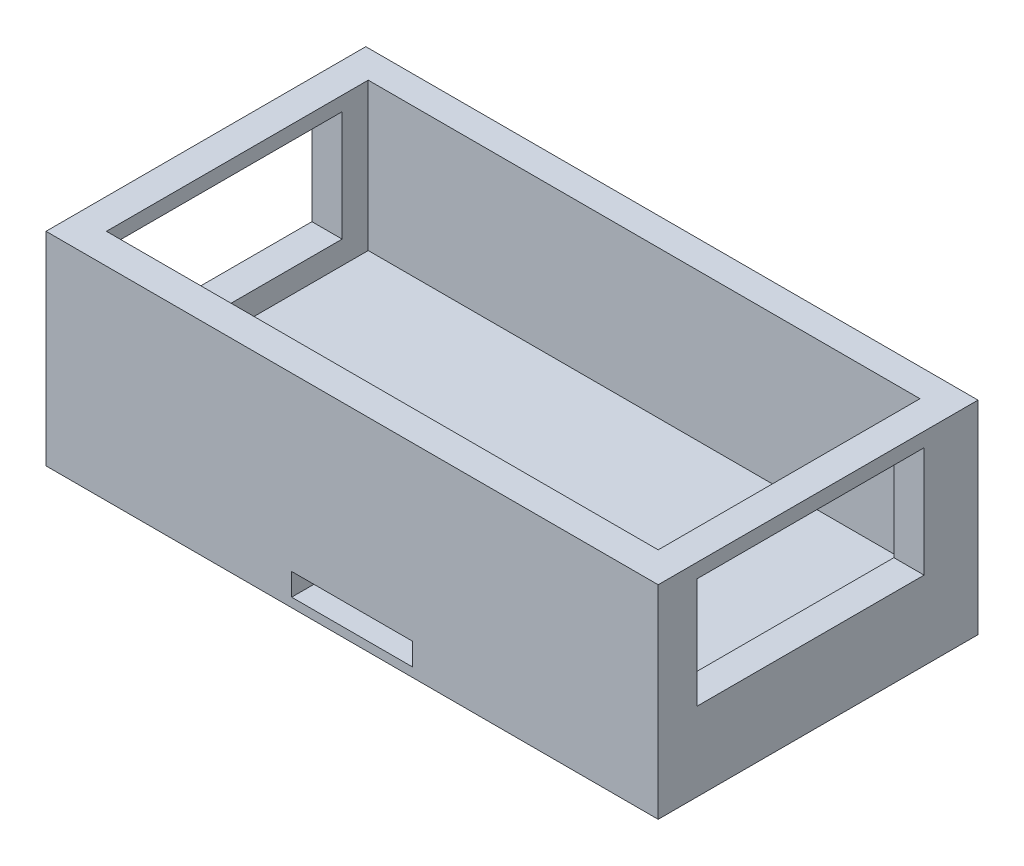
ISO-10303-21;
HEADER;
FILE_DESCRIPTION(('STEP AP214'),'2;1');
FILE_NAME('part.step','',(''),(''),'','','');
FILE_SCHEMA(('AUTOMOTIVE_DESIGN { 1 0 10303 214 1 1 1 1 }'));
ENDSEC;
DATA;
#1=APPLICATION_CONTEXT('core data for automotive mechanical design processes');
#2=APPLICATION_PROTOCOL_DEFINITION('international standard','automotive_design',2000,#1);
#3=PRODUCT_CONTEXT('',#1,'mechanical');
#4=PRODUCT('Part','Part','',(#3));
#5=PRODUCT_RELATED_PRODUCT_CATEGORY('part','',(#4));
#6=PRODUCT_DEFINITION_FORMATION('','',#4);
#7=PRODUCT_DEFINITION_CONTEXT('part definition',#1,'design');
#8=PRODUCT_DEFINITION('design','',#6,#7);
#9=PRODUCT_DEFINITION_SHAPE('','',#8);
#10=(LENGTH_UNIT() NAMED_UNIT(*) SI_UNIT(.MILLI.,.METRE.));
#11=(NAMED_UNIT(*) PLANE_ANGLE_UNIT() SI_UNIT($,.RADIAN.));
#12=(NAMED_UNIT(*) SI_UNIT($,.STERADIAN.) SOLID_ANGLE_UNIT());
#13=UNCERTAINTY_MEASURE_WITH_UNIT(LENGTH_MEASURE(1.E-05),#10,'distance_accuracy_value','');
#14=(GEOMETRIC_REPRESENTATION_CONTEXT(3) GLOBAL_UNCERTAINTY_ASSIGNED_CONTEXT((#13)) GLOBAL_UNIT_ASSIGNED_CONTEXT((#10,
#11,#12)) REPRESENTATION_CONTEXT('',''));
#15=CARTESIAN_POINT('',(0.,0.,0.));
#16=DIRECTION('',(0.,0.,1.));
#17=DIRECTION('',(1.,0.,0.));
#18=AXIS2_PLACEMENT_3D('',#15,#16,#17);
#19=CARTESIAN_POINT('',(0.,42.6974,0.));
#20=DIRECTION('',(1.,0.,0.));
#21=DIRECTION('',(0.,0.,-1.));
#22=AXIS2_PLACEMENT_3D('',#19,#20,#21);
#23=PLANE('',#22);
#24=DIRECTION('',(0.,0.,1.));
#25=VECTOR('',#24,1.);
#26=CARTESIAN_POINT('',(0.,0.,0.));
#27=LINE('',#26,#25);
#28=CARTESIAN_POINT('',(0.,0.,-67.2084));
#29=VERTEX_POINT('',#28);
#30=CARTESIAN_POINT('',(0.,0.,0.));
#31=VERTEX_POINT('',#30);
#32=EDGE_CURVE('E284',#29,#31,#27,.T.);
#33=ORIENTED_EDGE('',*,*,#32,.T.);
#34=DIRECTION('',(0.,-1.,0.));
#35=VECTOR('',#34,1.);
#36=CARTESIAN_POINT('',(0.,42.6974,0.));
#37=LINE('',#36,#35);
#38=CARTESIAN_POINT('',(0.,42.6974,0.));
#39=VERTEX_POINT('',#38);
#40=EDGE_CURVE('E317',#39,#31,#37,.T.);
#41=ORIENTED_EDGE('',*,*,#40,.F.);
#42=DIRECTION('',(0.,0.,1.));
#43=VECTOR('',#42,1.);
#44=CARTESIAN_POINT('',(0.,42.6974,0.));
#45=LINE('',#44,#43);
#46=CARTESIAN_POINT('',(0.,42.6974,-67.2084));
#47=VERTEX_POINT('',#46);
#48=EDGE_CURVE('E291',#47,#39,#45,.T.);
#49=ORIENTED_EDGE('',*,*,#48,.F.);
#50=DIRECTION('',(0.,-1.,0.));
#51=VECTOR('',#50,1.);
#52=CARTESIAN_POINT('',(0.,42.6974,-67.2084));
#53=LINE('',#52,#51);
#54=EDGE_CURVE('E301',#47,#29,#53,.T.);
#55=ORIENTED_EDGE('',*,*,#54,.T.);
#56=EDGE_LOOP('',(#33,#41,#49,#55));
#57=FACE_BOUND('',#56,.T.);
#58=DIRECTION('',(0.,-1.,0.));
#59=VECTOR('',#58,1.);
#60=CARTESIAN_POINT('',(0.,16.51,-8.128));
#61=LINE('',#60,#59);
#62=CARTESIAN_POINT('',(0.,39.6953082570497,-8.128));
#63=VERTEX_POINT('',#62);
#64=CARTESIAN_POINT('',(0.,16.51,-8.128));
#65=VERTEX_POINT('',#64);
#66=EDGE_CURVE('E50',#63,#65,#61,.T.);
#67=ORIENTED_EDGE('',*,*,#66,.T.);
#68=DIRECTION('',(0.,0.,-1.));
#69=VECTOR('',#68,1.);
#70=CARTESIAN_POINT('',(0.,16.51,-8.128));
#71=LINE('',#70,#69);
#72=CARTESIAN_POINT('',(0.,16.51,-55.88));
#73=VERTEX_POINT('',#72);
#74=EDGE_CURVE('E188',#65,#73,#71,.T.);
#75=ORIENTED_EDGE('',*,*,#74,.T.);
#76=DIRECTION('',(0.,1.,0.));
#77=VECTOR('',#76,1.);
#78=CARTESIAN_POINT('',(0.,16.51,-55.88));
#79=LINE('',#78,#77);
#80=CARTESIAN_POINT('',(0.,39.6953082570497,-55.88));
#81=VERTEX_POINT('',#80);
#82=EDGE_CURVE('E191',#73,#81,#79,.T.);
#83=ORIENTED_EDGE('',*,*,#82,.T.);
#84=DIRECTION('',(0.,0.,1.));
#85=VECTOR('',#84,1.);
#86=CARTESIAN_POINT('',(0.,39.6953082570497,-8.128));
#87=LINE('',#86,#85);
#88=EDGE_CURVE('E197',#81,#63,#87,.T.);
#89=ORIENTED_EDGE('',*,*,#88,.T.);
#90=EDGE_LOOP('',(#67,#75,#83,#89));
#91=FACE_BOUND('',#90,.T.);
#92=ADVANCED_FACE('F36',(#57,#91),#23,.F.);
#93=CARTESIAN_POINT('',(6.35,11.684,-6.35));
#94=DIRECTION('',(-1.,0.,0.));
#95=DIRECTION('',(0.,0.,1.));
#96=AXIS2_PLACEMENT_3D('',#93,#94,#95);
#97=PLANE('',#96);
#98=DIRECTION('',(0.,0.,1.));
#99=VECTOR('',#98,1.);
#100=CARTESIAN_POINT('',(6.35,42.6974,-6.35));
#101=LINE('',#100,#99);
#102=CARTESIAN_POINT('',(6.35,42.6974,-61.3664));
#103=VERTEX_POINT('',#102);
#104=CARTESIAN_POINT('',(6.35,42.6974,-6.35));
#105=VERTEX_POINT('',#104);
#106=EDGE_CURVE('E252',#103,#105,#101,.T.);
#107=ORIENTED_EDGE('',*,*,#106,.T.);
#108=DIRECTION('',(0.,1.,0.));
#109=VECTOR('',#108,1.);
#110=CARTESIAN_POINT('',(6.35,11.684,-6.35));
#111=LINE('',#110,#109);
#112=CARTESIAN_POINT('',(6.35,11.684,-6.35));
#113=VERTEX_POINT('',#112);
#114=EDGE_CURVE('E272',#113,#105,#111,.T.);
#115=ORIENTED_EDGE('',*,*,#114,.F.);
#116=DIRECTION('',(0.,0.,1.));
#117=VECTOR('',#116,1.);
#118=CARTESIAN_POINT('',(6.35,11.684,-6.35));
#119=LINE('',#118,#117);
#120=CARTESIAN_POINT('',(6.35,11.684,-61.3664));
#121=VERTEX_POINT('',#120);
#122=EDGE_CURVE('E259',#121,#113,#119,.T.);
#123=ORIENTED_EDGE('',*,*,#122,.F.);
#124=DIRECTION('',(0.,1.,0.));
#125=VECTOR('',#124,1.);
#126=CARTESIAN_POINT('',(6.35,11.684,-61.3664));
#127=LINE('',#126,#125);
#128=EDGE_CURVE('E282',#121,#103,#127,.T.);
#129=ORIENTED_EDGE('',*,*,#128,.T.);
#130=EDGE_LOOP('',(#107,#115,#123,#129));
#131=FACE_BOUND('',#130,.T.);
#132=DIRECTION('',(0.,-1.,0.));
#133=VECTOR('',#132,1.);
#134=CARTESIAN_POINT('',(6.35,16.51,-8.128));
#135=LINE('',#134,#133);
#136=CARTESIAN_POINT('',(6.35,39.6953082570497,-8.128));
#137=VERTEX_POINT('',#136);
#138=CARTESIAN_POINT('',(6.35,16.51,-8.128));
#139=VERTEX_POINT('',#138);
#140=EDGE_CURVE('E180',#137,#139,#135,.T.);
#141=ORIENTED_EDGE('',*,*,#140,.F.);
#142=DIRECTION('',(0.,0.,1.));
#143=VECTOR('',#142,1.);
#144=CARTESIAN_POINT('',(6.35,39.6953082570497,-8.128));
#145=LINE('',#144,#143);
#146=CARTESIAN_POINT('',(6.35,39.6953082570497,-55.88));
#147=VERTEX_POINT('',#146);
#148=EDGE_CURVE('E172',#147,#137,#145,.T.);
#149=ORIENTED_EDGE('',*,*,#148,.F.);
#150=DIRECTION('',(0.,1.,0.));
#151=VECTOR('',#150,1.);
#152=CARTESIAN_POINT('',(6.35,16.51,-55.88));
#153=LINE('',#152,#151);
#154=CARTESIAN_POINT('',(6.35,16.51,-55.88));
#155=VERTEX_POINT('',#154);
#156=EDGE_CURVE('E179',#155,#147,#153,.T.);
#157=ORIENTED_EDGE('',*,*,#156,.F.);
#158=DIRECTION('',(0.,0.,-1.));
#159=VECTOR('',#158,1.);
#160=CARTESIAN_POINT('',(6.35,16.51,-8.128));
#161=LINE('',#160,#159);
#162=EDGE_CURVE('E184',#139,#155,#161,.T.);
#163=ORIENTED_EDGE('',*,*,#162,.F.);
#164=EDGE_LOOP('',(#141,#149,#157,#163));
#165=FACE_BOUND('',#164,.T.);
#166=ADVANCED_FACE('F187',(#131,#165),#97,.F.);
#167=CARTESIAN_POINT('',(0.,42.6974,0.));
#168=DIRECTION('',(0.,0.,-1.));
#169=DIRECTION('',(-1.,0.,0.));
#170=AXIS2_PLACEMENT_3D('',#167,#168,#169);
#171=PLANE('',#170);
#172=DIRECTION('',(1.,0.,0.));
#173=VECTOR('',#172,1.);
#174=CARTESIAN_POINT('',(51.6255,1.91937937556223,0.));
#175=LINE('',#174,#173);
#176=CARTESIAN_POINT('',(51.6255,1.91937937556223,0.));
#177=VERTEX_POINT('',#176);
#178=CARTESIAN_POINT('',(77.0255,1.91937937556223,0.));
#179=VERTEX_POINT('',#178);
#180=EDGE_CURVE('E240',#177,#179,#175,.T.);
#181=ORIENTED_EDGE('',*,*,#180,.F.);
#182=DIRECTION('',(0.,-1.,0.));
#183=VECTOR('',#182,1.);
#184=CARTESIAN_POINT('',(51.6255,1.91937937556223,0.));
#185=LINE('',#184,#183);
#186=CARTESIAN_POINT('',(51.6255,6.604,0.));
#187=VERTEX_POINT('',#186);
#188=EDGE_CURVE('E232',#187,#177,#185,.T.);
#189=ORIENTED_EDGE('',*,*,#188,.F.);
#190=DIRECTION('',(-1.,0.,0.));
#191=VECTOR('',#190,1.);
#192=CARTESIAN_POINT('',(51.6255,6.604,0.));
#193=LINE('',#192,#191);
#194=CARTESIAN_POINT('',(77.0255,6.604,0.));
#195=VERTEX_POINT('',#194);
#196=EDGE_CURVE('E246',#195,#187,#193,.T.);
#197=ORIENTED_EDGE('',*,*,#196,.F.);
#198=DIRECTION('',(0.,1.,0.));
#199=VECTOR('',#198,1.);
#200=CARTESIAN_POINT('',(77.0255,1.91937937556223,0.));
#201=LINE('',#200,#199);
#202=EDGE_CURVE('E243',#179,#195,#201,.T.);
#203=ORIENTED_EDGE('',*,*,#202,.F.);
#204=EDGE_LOOP('',(#181,#189,#197,#203));
#205=FACE_BOUND('',#204,.T.);
#206=DIRECTION('',(1.,0.,0.));
#207=VECTOR('',#206,1.);
#208=CARTESIAN_POINT('',(0.,0.,0.));
#209=LINE('',#208,#207);
#210=CARTESIAN_POINT('',(128.651,0.,0.));
#211=VERTEX_POINT('',#210);
#212=EDGE_CURVE('E304',#31,#211,#209,.T.);
#213=ORIENTED_EDGE('',*,*,#212,.T.);
#214=DIRECTION('',(0.,-1.,0.));
#215=VECTOR('',#214,1.);
#216=CARTESIAN_POINT('',(128.651,42.6974,0.));
#217=LINE('',#216,#215);
#218=CARTESIAN_POINT('',(128.651,42.6974,0.));
#219=VERTEX_POINT('',#218);
#220=EDGE_CURVE('E314',#219,#211,#217,.T.);
#221=ORIENTED_EDGE('',*,*,#220,.F.);
#222=DIRECTION('',(1.,0.,0.));
#223=VECTOR('',#222,1.);
#224=CARTESIAN_POINT('',(0.,42.6974,0.));
#225=LINE('',#224,#223);
#226=EDGE_CURVE('E294',#39,#219,#225,.T.);
#227=ORIENTED_EDGE('',*,*,#226,.F.);
#228=ORIENTED_EDGE('',*,*,#40,.T.);
#229=EDGE_LOOP('',(#213,#221,#227,#228));
#230=FACE_BOUND('',#229,.T.);
#231=ADVANCED_FACE('F341',(#205,#230),#171,.F.);
#232=CARTESIAN_POINT('',(128.651,42.6974,0.));
#233=DIRECTION('',(-1.,0.,0.));
#234=DIRECTION('',(0.,0.,1.));
#235=AXIS2_PLACEMENT_3D('',#232,#233,#234);
#236=PLANE('',#235);
#237=DIRECTION('',(0.,0.,-1.));
#238=VECTOR('',#237,1.);
#239=CARTESIAN_POINT('',(128.651,16.51,-8.128));
#240=LINE('',#239,#238);
#241=CARTESIAN_POINT('',(128.651,16.51,-8.128));
#242=VERTEX_POINT('',#241);
#243=CARTESIAN_POINT('',(128.651,16.51,-55.88));
#244=VERTEX_POINT('',#243);
#245=EDGE_CURVE('E222',#242,#244,#240,.T.);
#246=ORIENTED_EDGE('',*,*,#245,.F.);
#247=DIRECTION('',(0.,-1.,0.));
#248=VECTOR('',#247,1.);
#249=CARTESIAN_POINT('',(128.651,16.51,-8.128));
#250=LINE('',#249,#248);
#251=CARTESIAN_POINT('',(128.651,39.6953082570497,-8.128));
#252=VERTEX_POINT('',#251);
#253=EDGE_CURVE('E203',#252,#242,#250,.T.);
#254=ORIENTED_EDGE('',*,*,#253,.F.);
#255=DIRECTION('',(0.,0.,1.));
#256=VECTOR('',#255,1.);
#257=CARTESIAN_POINT('',(128.651,39.6953082570497,-8.128));
#258=LINE('',#257,#256);
#259=CARTESIAN_POINT('',(128.651,39.6953082570497,-55.88));
#260=VERTEX_POINT('',#259);
#261=EDGE_CURVE('E211',#260,#252,#258,.T.);
#262=ORIENTED_EDGE('',*,*,#261,.F.);
#263=DIRECTION('',(0.,1.,0.));
#264=VECTOR('',#263,1.);
#265=CARTESIAN_POINT('',(128.651,16.51,-55.88));
#266=LINE('',#265,#264);
#267=EDGE_CURVE('E225',#244,#260,#266,.T.);
#268=ORIENTED_EDGE('',*,*,#267,.F.);
#269=EDGE_LOOP('',(#246,#254,#262,#268));
#270=FACE_BOUND('',#269,.T.);
#271=DIRECTION('',(0.,0.,-1.));
#272=VECTOR('',#271,1.);
#273=CARTESIAN_POINT('',(128.651,0.,0.));
#274=LINE('',#273,#272);
#275=CARTESIAN_POINT('',(128.651,0.,-67.2084));
#276=VERTEX_POINT('',#275);
#277=EDGE_CURVE('E306',#211,#276,#274,.T.);
#278=ORIENTED_EDGE('',*,*,#277,.T.);
#279=DIRECTION('',(0.,-1.,0.));
#280=VECTOR('',#279,1.);
#281=CARTESIAN_POINT('',(128.651,42.6974,-67.2084));
#282=LINE('',#281,#280);
#283=CARTESIAN_POINT('',(128.651,42.6974,-67.2084));
#284=VERTEX_POINT('',#283);
#285=EDGE_CURVE('E311',#284,#276,#282,.T.);
#286=ORIENTED_EDGE('',*,*,#285,.F.);
#287=DIRECTION('',(0.,0.,-1.));
#288=VECTOR('',#287,1.);
#289=CARTESIAN_POINT('',(128.651,42.6974,0.));
#290=LINE('',#289,#288);
#291=EDGE_CURVE('E297',#219,#284,#290,.T.);
#292=ORIENTED_EDGE('',*,*,#291,.F.);
#293=ORIENTED_EDGE('',*,*,#220,.T.);
#294=EDGE_LOOP('',(#278,#286,#292,#293));
#295=FACE_BOUND('',#294,.T.);
#296=ADVANCED_FACE('F431',(#270,#295),#236,.F.);
#297=CARTESIAN_POINT('',(0.,42.6974,-67.2084));
#298=DIRECTION('',(0.,0.,1.));
#299=DIRECTION('',(1.,0.,0.));
#300=AXIS2_PLACEMENT_3D('',#297,#298,#299);
#301=PLANE('',#300);
#302=DIRECTION('',(-1.,0.,0.));
#303=VECTOR('',#302,1.);
#304=CARTESIAN_POINT('',(0.,6.604,-67.2084));
#305=LINE('',#304,#303);
#306=CARTESIAN_POINT('',(77.0255,6.604,-67.2084));
#307=VERTEX_POINT('',#306);
#308=CARTESIAN_POINT('',(51.6255,6.604,-67.2084));
#309=VERTEX_POINT('',#308);
#310=EDGE_CURVE('E43',#307,#309,#305,.T.);
#311=ORIENTED_EDGE('',*,*,#310,.T.);
#312=DIRECTION('',(0.,-1.,0.));
#313=VECTOR('',#312,1.);
#314=CARTESIAN_POINT('',(51.6255,42.6974,-67.2084));
#315=LINE('',#314,#313);
#316=CARTESIAN_POINT('',(51.6255,1.91937937556223,-67.2084));
#317=VERTEX_POINT('',#316);
#318=EDGE_CURVE('E11',#309,#317,#315,.T.);
#319=ORIENTED_EDGE('',*,*,#318,.T.);
#320=DIRECTION('',(1.,0.,0.));
#321=VECTOR('',#320,1.);
#322=CARTESIAN_POINT('',(0.,1.91937937556223,-67.2084));
#323=LINE('',#322,#321);
#324=CARTESIAN_POINT('',(77.0255,1.91937937556223,-67.2084));
#325=VERTEX_POINT('',#324);
#326=EDGE_CURVE('E320',#317,#325,#323,.T.);
#327=ORIENTED_EDGE('',*,*,#326,.T.);
#328=DIRECTION('',(0.,1.,0.));
#329=VECTOR('',#328,1.);
#330=CARTESIAN_POINT('',(77.0255,42.6974,-67.2084));
#331=LINE('',#330,#329);
#332=EDGE_CURVE('E323',#325,#307,#331,.T.);
#333=ORIENTED_EDGE('',*,*,#332,.T.);
#334=EDGE_LOOP('',(#311,#319,#327,#333));
#335=FACE_BOUND('',#334,.T.);
#336=DIRECTION('',(-1.,0.,0.));
#337=VECTOR('',#336,1.);
#338=CARTESIAN_POINT('',(0.,0.,-67.2084));
#339=LINE('',#338,#337);
#340=EDGE_CURVE('E295',#276,#29,#339,.T.);
#341=ORIENTED_EDGE('',*,*,#340,.T.);
#342=ORIENTED_EDGE('',*,*,#54,.F.);
#343=DIRECTION('',(-1.,0.,0.));
#344=VECTOR('',#343,1.);
#345=CARTESIAN_POINT('',(0.,42.6974,-67.2084));
#346=LINE('',#345,#344);
#347=EDGE_CURVE('E299',#284,#47,#346,.T.);
#348=ORIENTED_EDGE('',*,*,#347,.F.);
#349=ORIENTED_EDGE('',*,*,#285,.T.);
#350=EDGE_LOOP('',(#341,#342,#348,#349));
#351=FACE_BOUND('',#350,.T.);
#352=ADVANCED_FACE('F327',(#335,#351),#301,.F.);
#353=CARTESIAN_POINT('',(0.,42.6974,0.));
#354=DIRECTION('',(0.,-1.,0.));
#355=DIRECTION('',(0.,0.,-1.));
#356=AXIS2_PLACEMENT_3D('',#353,#354,#355);
#357=PLANE('',#356);
#358=DIRECTION('',(1.,0.,0.));
#359=VECTOR('',#358,1.);
#360=CARTESIAN_POINT('',(6.35,42.6974,-6.35));
#361=LINE('',#360,#359);
#362=CARTESIAN_POINT('',(122.301,42.6974,-6.35));
#363=VERTEX_POINT('',#362);
#364=EDGE_CURVE('E274',#105,#363,#361,.T.);
#365=ORIENTED_EDGE('',*,*,#364,.F.);
#366=ORIENTED_EDGE('',*,*,#106,.F.);
#367=DIRECTION('',(-1.,0.,0.));
#368=VECTOR('',#367,1.);
#369=CARTESIAN_POINT('',(6.35,42.6974,-61.3664));
#370=LINE('',#369,#368);
#371=CARTESIAN_POINT('',(122.301,42.6974,-61.3664));
#372=VERTEX_POINT('',#371);
#373=EDGE_CURVE('E263',#372,#103,#370,.T.);
#374=ORIENTED_EDGE('',*,*,#373,.F.);
#375=DIRECTION('',(0.,0.,-1.));
#376=VECTOR('',#375,1.);
#377=CARTESIAN_POINT('',(122.301,42.6974,-6.35));
#378=LINE('',#377,#376);
#379=EDGE_CURVE('E277',#363,#372,#378,.T.);
#380=ORIENTED_EDGE('',*,*,#379,.F.);
#381=EDGE_LOOP('',(#365,#366,#374,#380));
#382=FACE_BOUND('',#381,.T.);
#383=ORIENTED_EDGE('',*,*,#48,.T.);
#384=ORIENTED_EDGE('',*,*,#226,.T.);
#385=ORIENTED_EDGE('',*,*,#291,.T.);
#386=ORIENTED_EDGE('',*,*,#347,.T.);
#387=EDGE_LOOP('',(#383,#384,#385,#386));
#388=FACE_BOUND('',#387,.T.);
#389=ADVANCED_FACE('F422',(#382,#388),#357,.F.);
#390=CARTESIAN_POINT('',(0.,0.,0.));
#391=DIRECTION('',(0.,-1.,0.));
#392=DIRECTION('',(0.,0.,-1.));
#393=AXIS2_PLACEMENT_3D('',#390,#391,#392);
#394=PLANE('',#393);
#395=ORIENTED_EDGE('',*,*,#32,.F.);
#396=ORIENTED_EDGE('',*,*,#340,.F.);
#397=ORIENTED_EDGE('',*,*,#277,.F.);
#398=ORIENTED_EDGE('',*,*,#212,.F.);
#399=EDGE_LOOP('',(#395,#396,#397,#398));
#400=FACE_BOUND('',#399,.T.);
#401=ADVANCED_FACE('F414',(#400),#394,.T.);
#402=CARTESIAN_POINT('',(6.35,11.684,-61.3664));
#403=DIRECTION('',(0.,0.,-1.));
#404=DIRECTION('',(-1.,0.,0.));
#405=AXIS2_PLACEMENT_3D('',#402,#403,#404);
#406=PLANE('',#405);
#407=ORIENTED_EDGE('',*,*,#373,.T.);
#408=ORIENTED_EDGE('',*,*,#128,.F.);
#409=DIRECTION('',(-1.,0.,0.));
#410=VECTOR('',#409,1.);
#411=CARTESIAN_POINT('',(6.35,11.684,-61.3664));
#412=LINE('',#411,#410);
#413=CARTESIAN_POINT('',(122.301,11.684,-61.3664));
#414=VERTEX_POINT('',#413);
#415=EDGE_CURVE('E269',#414,#121,#412,.T.);
#416=ORIENTED_EDGE('',*,*,#415,.F.);
#417=DIRECTION('',(0.,1.,0.));
#418=VECTOR('',#417,1.);
#419=CARTESIAN_POINT('',(122.301,11.684,-61.3664));
#420=LINE('',#419,#418);
#421=EDGE_CURVE('E285',#414,#372,#420,.T.);
#422=ORIENTED_EDGE('',*,*,#421,.T.);
#423=EDGE_LOOP('',(#407,#408,#416,#422));
#424=FACE_BOUND('',#423,.T.);
#425=ADVANCED_FACE('F410',(#424),#406,.F.);
#426=CARTESIAN_POINT('',(122.301,11.684,-6.35));
#427=DIRECTION('',(1.,0.,0.));
#428=DIRECTION('',(0.,0.,-1.));
#429=AXIS2_PLACEMENT_3D('',#426,#427,#428);
#430=PLANE('',#429);
#431=DIRECTION('',(0.,0.,1.));
#432=VECTOR('',#431,1.);
#433=CARTESIAN_POINT('',(122.301,39.6953082570497,-8.128));
#434=LINE('',#433,#432);
#435=CARTESIAN_POINT('',(122.301,39.6953082570497,-55.88));
#436=VERTEX_POINT('',#435);
#437=CARTESIAN_POINT('',(122.301,39.6953082570497,-8.128));
#438=VERTEX_POINT('',#437);
#439=EDGE_CURVE('E217',#436,#438,#434,.T.);
#440=ORIENTED_EDGE('',*,*,#439,.T.);
#441=DIRECTION('',(0.,-1.,0.));
#442=VECTOR('',#441,1.);
#443=CARTESIAN_POINT('',(122.301,16.51,-8.128));
#444=LINE('',#443,#442);
#445=CARTESIAN_POINT('',(122.301,16.51,-8.128));
#446=VERTEX_POINT('',#445);
#447=EDGE_CURVE('E207',#438,#446,#444,.T.);
#448=ORIENTED_EDGE('',*,*,#447,.T.);
#449=DIRECTION('',(0.,0.,-1.));
#450=VECTOR('',#449,1.);
#451=CARTESIAN_POINT('',(122.301,16.51,-8.128));
#452=LINE('',#451,#450);
#453=CARTESIAN_POINT('',(122.301,16.51,-55.88));
#454=VERTEX_POINT('',#453);
#455=EDGE_CURVE('E210',#446,#454,#452,.T.);
#456=ORIENTED_EDGE('',*,*,#455,.T.);
#457=DIRECTION('',(0.,1.,0.));
#458=VECTOR('',#457,1.);
#459=CARTESIAN_POINT('',(122.301,16.51,-55.88));
#460=LINE('',#459,#458);
#461=EDGE_CURVE('E214',#454,#436,#460,.T.);
#462=ORIENTED_EDGE('',*,*,#461,.T.);
#463=EDGE_LOOP('',(#440,#448,#456,#462));
#464=FACE_BOUND('',#463,.T.);
#465=ORIENTED_EDGE('',*,*,#379,.T.);
#466=ORIENTED_EDGE('',*,*,#421,.F.);
#467=DIRECTION('',(0.,0.,-1.));
#468=VECTOR('',#467,1.);
#469=CARTESIAN_POINT('',(122.301,11.684,-6.35));
#470=LINE('',#469,#468);
#471=CARTESIAN_POINT('',(122.301,11.684,-6.35));
#472=VERTEX_POINT('',#471);
#473=EDGE_CURVE('E266',#472,#414,#470,.T.);
#474=ORIENTED_EDGE('',*,*,#473,.F.);
#475=DIRECTION('',(0.,1.,0.));
#476=VECTOR('',#475,1.);
#477=CARTESIAN_POINT('',(122.301,11.684,-6.35));
#478=LINE('',#477,#476);
#479=EDGE_CURVE('E287',#472,#363,#478,.T.);
#480=ORIENTED_EDGE('',*,*,#479,.T.);
#481=EDGE_LOOP('',(#465,#466,#474,#480));
#482=FACE_BOUND('',#481,.T.);
#483=ADVANCED_FACE('F413',(#464,#482),#430,.F.);
#484=CARTESIAN_POINT('',(6.35,11.684,-6.35));
#485=DIRECTION('',(0.,0.,1.));
#486=DIRECTION('',(1.,0.,0.));
#487=AXIS2_PLACEMENT_3D('',#484,#485,#486);
#488=PLANE('',#487);
#489=ORIENTED_EDGE('',*,*,#364,.T.);
#490=ORIENTED_EDGE('',*,*,#479,.F.);
#491=DIRECTION('',(1.,0.,0.));
#492=VECTOR('',#491,1.);
#493=CARTESIAN_POINT('',(6.35,11.684,-6.35));
#494=LINE('',#493,#492);
#495=EDGE_CURVE('E262',#113,#472,#494,.T.);
#496=ORIENTED_EDGE('',*,*,#495,.F.);
#497=ORIENTED_EDGE('',*,*,#114,.T.);
#498=EDGE_LOOP('',(#489,#490,#496,#497));
#499=FACE_BOUND('',#498,.T.);
#500=ADVANCED_FACE('F406',(#499),#488,.F.);
#501=CARTESIAN_POINT('',(0.,11.684,0.));
#502=DIRECTION('',(0.,-1.,0.));
#503=DIRECTION('',(0.,0.,-1.));
#504=AXIS2_PLACEMENT_3D('',#501,#502,#503);
#505=PLANE('',#504);
#506=ORIENTED_EDGE('',*,*,#122,.T.);
#507=ORIENTED_EDGE('',*,*,#495,.T.);
#508=ORIENTED_EDGE('',*,*,#473,.T.);
#509=ORIENTED_EDGE('',*,*,#415,.T.);
#510=EDGE_LOOP('',(#506,#507,#508,#509));
#511=FACE_BOUND('',#510,.T.);
#512=ADVANCED_FACE('F402',(#511),#505,.F.);
#513=CARTESIAN_POINT('',(51.6255,1.91937937556223,-67.7164));
#514=DIRECTION('',(-1.,0.,0.));
#515=DIRECTION('',(0.,0.,1.));
#516=AXIS2_PLACEMENT_3D('',#513,#514,#515);
#517=PLANE('',#516);
#518=DIRECTION('',(0.,0.,1.));
#519=VECTOR('',#518,1.);
#520=CARTESIAN_POINT('',(51.6255,6.604,-67.7164));
#521=LINE('',#520,#519);
#522=EDGE_CURVE('E250',#309,#187,#521,.T.);
#523=ORIENTED_EDGE('',*,*,#522,.T.);
#524=ORIENTED_EDGE('',*,*,#188,.T.);
#525=DIRECTION('',(0.,0.,1.));
#526=VECTOR('',#525,1.);
#527=CARTESIAN_POINT('',(51.6255,1.91937937556223,-67.7164));
#528=LINE('',#527,#526);
#529=EDGE_CURVE('E249',#317,#177,#528,.T.);
#530=ORIENTED_EDGE('',*,*,#529,.F.);
#531=ORIENTED_EDGE('',*,*,#318,.F.);
#532=EDGE_LOOP('',(#523,#524,#530,#531));
#533=FACE_BOUND('',#532,.T.);
#534=ADVANCED_FACE('F345',(#533),#517,.F.);
#535=CARTESIAN_POINT('',(51.6255,6.604,-67.7164));
#536=DIRECTION('',(0.,1.,0.));
#537=DIRECTION('',(0.,0.,1.));
#538=AXIS2_PLACEMENT_3D('',#535,#536,#537);
#539=PLANE('',#538);
#540=DIRECTION('',(0.,0.,1.));
#541=VECTOR('',#540,1.);
#542=CARTESIAN_POINT('',(77.0255,6.604,-67.7164));
#543=LINE('',#542,#541);
#544=EDGE_CURVE('E253',#307,#195,#543,.T.);
#545=ORIENTED_EDGE('',*,*,#544,.T.);
#546=ORIENTED_EDGE('',*,*,#196,.T.);
#547=ORIENTED_EDGE('',*,*,#522,.F.);
#548=ORIENTED_EDGE('',*,*,#310,.F.);
#549=EDGE_LOOP('',(#545,#546,#547,#548));
#550=FACE_BOUND('',#549,.T.);
#551=ADVANCED_FACE('F333',(#550),#539,.F.);
#552=CARTESIAN_POINT('',(77.0255,1.91937937556223,-67.7164));
#553=DIRECTION('',(1.,0.,0.));
#554=DIRECTION('',(0.,0.,-1.));
#555=AXIS2_PLACEMENT_3D('',#552,#553,#554);
#556=PLANE('',#555);
#557=DIRECTION('',(0.,0.,1.));
#558=VECTOR('',#557,1.);
#559=CARTESIAN_POINT('',(77.0255,1.91937937556223,-67.7164));
#560=LINE('',#559,#558);
#561=EDGE_CURVE('E255',#325,#179,#560,.T.);
#562=ORIENTED_EDGE('',*,*,#561,.T.);
#563=ORIENTED_EDGE('',*,*,#202,.T.);
#564=ORIENTED_EDGE('',*,*,#544,.F.);
#565=ORIENTED_EDGE('',*,*,#332,.F.);
#566=EDGE_LOOP('',(#562,#563,#564,#565));
#567=FACE_BOUND('',#566,.T.);
#568=ADVANCED_FACE('F335',(#567),#556,.F.);
#569=CARTESIAN_POINT('',(51.6255,1.91937937556223,-67.7164));
#570=DIRECTION('',(0.,-1.,0.));
#571=DIRECTION('',(0.,0.,-1.));
#572=AXIS2_PLACEMENT_3D('',#569,#570,#571);
#573=PLANE('',#572);
#574=ORIENTED_EDGE('',*,*,#529,.T.);
#575=ORIENTED_EDGE('',*,*,#180,.T.);
#576=ORIENTED_EDGE('',*,*,#561,.F.);
#577=ORIENTED_EDGE('',*,*,#326,.F.);
#578=EDGE_LOOP('',(#574,#575,#576,#577));
#579=FACE_BOUND('',#578,.T.);
#580=ADVANCED_FACE('F347',(#579),#573,.F.);
#581=CARTESIAN_POINT('',(122.301,16.51,-8.128));
#582=DIRECTION('',(0.,0.,1.));
#583=DIRECTION('',(1.,0.,0.));
#584=AXIS2_PLACEMENT_3D('',#581,#582,#583);
#585=PLANE('',#584);
#586=ORIENTED_EDGE('',*,*,#253,.T.);
#587=DIRECTION('',(1.,0.,0.));
#588=VECTOR('',#587,1.);
#589=CARTESIAN_POINT('',(122.301,16.51,-8.128));
#590=LINE('',#589,#588);
#591=EDGE_CURVE('E220',#446,#242,#590,.T.);
#592=ORIENTED_EDGE('',*,*,#591,.F.);
#593=ORIENTED_EDGE('',*,*,#447,.F.);
#594=DIRECTION('',(1.,0.,0.));
#595=VECTOR('',#594,1.);
#596=CARTESIAN_POINT('',(122.301,39.6953082570497,-8.128));
#597=LINE('',#596,#595);
#598=EDGE_CURVE('E230',#438,#252,#597,.T.);
#599=ORIENTED_EDGE('',*,*,#598,.T.);
#600=EDGE_LOOP('',(#586,#592,#593,#599));
#601=FACE_BOUND('',#600,.T.);
#602=ADVANCED_FACE('F349',(#601),#585,.F.);
#603=CARTESIAN_POINT('',(122.301,39.6953082570497,-8.128));
#604=DIRECTION('',(0.,1.,0.));
#605=DIRECTION('',(0.,0.,1.));
#606=AXIS2_PLACEMENT_3D('',#603,#604,#605);
#607=PLANE('',#606);
#608=ORIENTED_EDGE('',*,*,#261,.T.);
#609=ORIENTED_EDGE('',*,*,#598,.F.);
#610=ORIENTED_EDGE('',*,*,#439,.F.);
#611=DIRECTION('',(1.,0.,0.));
#612=VECTOR('',#611,1.);
#613=CARTESIAN_POINT('',(122.301,39.6953082570497,-55.88));
#614=LINE('',#613,#612);
#615=EDGE_CURVE('E233',#436,#260,#614,.T.);
#616=ORIENTED_EDGE('',*,*,#615,.T.);
#617=EDGE_LOOP('',(#608,#609,#610,#616));
#618=FACE_BOUND('',#617,.T.);
#619=ADVANCED_FACE('F355',(#618),#607,.F.);
#620=CARTESIAN_POINT('',(122.301,16.51,-55.88));
#621=DIRECTION('',(0.,0.,-1.));
#622=DIRECTION('',(0.,1.,0.));
#623=AXIS2_PLACEMENT_3D('',#620,#621,#622);
#624=PLANE('',#623);
#625=ORIENTED_EDGE('',*,*,#267,.T.);
#626=ORIENTED_EDGE('',*,*,#615,.F.);
#627=ORIENTED_EDGE('',*,*,#461,.F.);
#628=DIRECTION('',(1.,0.,0.));
#629=VECTOR('',#628,1.);
#630=CARTESIAN_POINT('',(122.301,16.51,-55.88));
#631=LINE('',#630,#629);
#632=EDGE_CURVE('E235',#454,#244,#631,.T.);
#633=ORIENTED_EDGE('',*,*,#632,.T.);
#634=EDGE_LOOP('',(#625,#626,#627,#633));
#635=FACE_BOUND('',#634,.T.);
#636=ADVANCED_FACE('F390',(#635),#624,.F.);
#637=CARTESIAN_POINT('',(122.301,16.51,-8.128));
#638=DIRECTION('',(0.,-1.,0.));
#639=DIRECTION('',(0.,0.,-1.));
#640=AXIS2_PLACEMENT_3D('',#637,#638,#639);
#641=PLANE('',#640);
#642=ORIENTED_EDGE('',*,*,#245,.T.);
#643=ORIENTED_EDGE('',*,*,#632,.F.);
#644=ORIENTED_EDGE('',*,*,#455,.F.);
#645=ORIENTED_EDGE('',*,*,#591,.T.);
#646=EDGE_LOOP('',(#642,#643,#644,#645));
#647=FACE_BOUND('',#646,.T.);
#648=ADVANCED_FACE('F383',(#647),#641,.F.);
#649=CARTESIAN_POINT('',(6.35,16.51,-8.128));
#650=DIRECTION('',(0.,0.,-1.));
#651=DIRECTION('',(-1.,0.,0.));
#652=AXIS2_PLACEMENT_3D('',#649,#650,#651);
#653=PLANE('',#652);
#654=ORIENTED_EDGE('',*,*,#66,.F.);
#655=DIRECTION('',(-1.,0.,0.));
#656=VECTOR('',#655,1.);
#657=CARTESIAN_POINT('',(6.35,39.6953082570497,-8.128));
#658=LINE('',#657,#656);
#659=EDGE_CURVE('E174',#137,#63,#658,.T.);
#660=ORIENTED_EDGE('',*,*,#659,.F.);
#661=ORIENTED_EDGE('',*,*,#140,.T.);
#662=DIRECTION('',(-1.,0.,0.));
#663=VECTOR('',#662,1.);
#664=CARTESIAN_POINT('',(6.35,16.51,-8.128));
#665=LINE('',#664,#663);
#666=EDGE_CURVE('E201',#139,#65,#665,.T.);
#667=ORIENTED_EDGE('',*,*,#666,.T.);
#668=EDGE_LOOP('',(#654,#660,#661,#667));
#669=FACE_BOUND('',#668,.T.);
#670=ADVANCED_FACE('F182',(#669),#653,.T.);
#671=CARTESIAN_POINT('',(6.35,16.51,-8.128));
#672=DIRECTION('',(0.,1.,0.));
#673=DIRECTION('',(0.,0.,1.));
#674=AXIS2_PLACEMENT_3D('',#671,#672,#673);
#675=PLANE('',#674);
#676=ORIENTED_EDGE('',*,*,#74,.F.);
#677=ORIENTED_EDGE('',*,*,#666,.F.);
#678=ORIENTED_EDGE('',*,*,#162,.T.);
#679=DIRECTION('',(-1.,0.,0.));
#680=VECTOR('',#679,1.);
#681=CARTESIAN_POINT('',(6.35,16.51,-55.88));
#682=LINE('',#681,#680);
#683=EDGE_CURVE('E204',#155,#73,#682,.T.);
#684=ORIENTED_EDGE('',*,*,#683,.T.);
#685=EDGE_LOOP('',(#676,#677,#678,#684));
#686=FACE_BOUND('',#685,.T.);
#687=ADVANCED_FACE('F375',(#686),#675,.T.);
#688=CARTESIAN_POINT('',(6.35,16.51,-55.88));
#689=DIRECTION('',(0.,0.,1.));
#690=DIRECTION('',(0.,-1.,0.));
#691=AXIS2_PLACEMENT_3D('',#688,#689,#690);
#692=PLANE('',#691);
#693=ORIENTED_EDGE('',*,*,#82,.F.);
#694=ORIENTED_EDGE('',*,*,#683,.F.);
#695=ORIENTED_EDGE('',*,*,#156,.T.);
#696=DIRECTION('',(-1.,0.,0.));
#697=VECTOR('',#696,1.);
#698=CARTESIAN_POINT('',(6.35,39.6953082570497,-55.88));
#699=LINE('',#698,#697);
#700=EDGE_CURVE('E58',#147,#81,#699,.T.);
#701=ORIENTED_EDGE('',*,*,#700,.T.);
#702=EDGE_LOOP('',(#693,#694,#695,#701));
#703=FACE_BOUND('',#702,.T.);
#704=ADVANCED_FACE('F373',(#703),#692,.T.);
#705=CARTESIAN_POINT('',(6.35,39.6953082570497,-8.128));
#706=DIRECTION('',(0.,-1.,0.));
#707=DIRECTION('',(0.,0.,-1.));
#708=AXIS2_PLACEMENT_3D('',#705,#706,#707);
#709=PLANE('',#708);
#710=ORIENTED_EDGE('',*,*,#88,.F.);
#711=ORIENTED_EDGE('',*,*,#700,.F.);
#712=ORIENTED_EDGE('',*,*,#148,.T.);
#713=ORIENTED_EDGE('',*,*,#659,.T.);
#714=EDGE_LOOP('',(#710,#711,#712,#713));
#715=FACE_BOUND('',#714,.T.);
#716=ADVANCED_FACE('F173',(#715),#709,.T.);
#717=CLOSED_SHELL('',(#92,#166,#231,#296,#352,#389,#401,#425,#483,#500,#512,#534,#551,#568,#580,
#602,#619,#636,#648,#670,#687,#704,#716));
#718=MANIFOLD_SOLID_BREP('B2',#717);
#719=ADVANCED_BREP_SHAPE_REPRESENTATION('',(#18,#718),#14);
#720=SHAPE_DEFINITION_REPRESENTATION(#9,#719);
ENDSEC;
END-ISO-10303-21;
